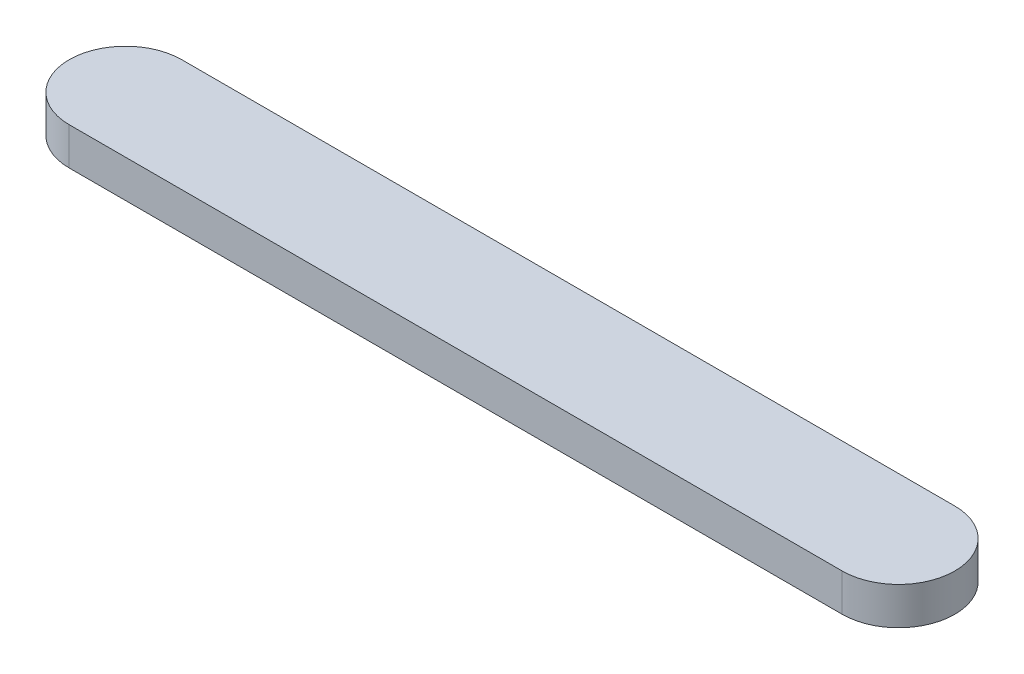
ISO-10303-21;
HEADER;
FILE_DESCRIPTION(('STEP AP214'),'2;1');
FILE_NAME('part.step','',(''),(''),'','','');
FILE_SCHEMA(('AUTOMOTIVE_DESIGN { 1 0 10303 214 1 1 1 1 }'));
ENDSEC;
DATA;
#1=APPLICATION_CONTEXT('core data for automotive mechanical design processes');
#2=APPLICATION_PROTOCOL_DEFINITION('international standard','automotive_design',2000,#1);
#3=PRODUCT_CONTEXT('',#1,'mechanical');
#4=PRODUCT('Part','Part','',(#3));
#5=PRODUCT_RELATED_PRODUCT_CATEGORY('part','',(#4));
#6=PRODUCT_DEFINITION_FORMATION('','',#4);
#7=PRODUCT_DEFINITION_CONTEXT('part definition',#1,'design');
#8=PRODUCT_DEFINITION('design','',#6,#7);
#9=PRODUCT_DEFINITION_SHAPE('','',#8);
#10=(LENGTH_UNIT() NAMED_UNIT(*) SI_UNIT(.MILLI.,.METRE.));
#11=(NAMED_UNIT(*) PLANE_ANGLE_UNIT() SI_UNIT($,.RADIAN.));
#12=(NAMED_UNIT(*) SI_UNIT($,.STERADIAN.) SOLID_ANGLE_UNIT());
#13=UNCERTAINTY_MEASURE_WITH_UNIT(LENGTH_MEASURE(1.E-05),#10,'distance_accuracy_value','');
#14=(GEOMETRIC_REPRESENTATION_CONTEXT(3) GLOBAL_UNCERTAINTY_ASSIGNED_CONTEXT((#13)) GLOBAL_UNIT_ASSIGNED_CONTEXT((#10,
#11,#12)) REPRESENTATION_CONTEXT('',''));
#15=CARTESIAN_POINT('',(0.,0.,0.));
#16=DIRECTION('',(0.,0.,1.));
#17=DIRECTION('',(1.,0.,0.));
#18=AXIS2_PLACEMENT_3D('',#15,#16,#17);
#19=CARTESIAN_POINT('',(-103.,10.,0.));
#20=DIRECTION('',(0.,-1.,0.));
#21=DIRECTION('',(0.,0.,-1.));
#22=AXIS2_PLACEMENT_3D('',#19,#20,#21);
#23=CYLINDRICAL_SURFACE('',#22,15.);
#24=CARTESIAN_POINT('',(-103.,0.,0.));
#25=DIRECTION('',(0.,1.,0.));
#26=DIRECTION('',(0.,0.,1.));
#27=AXIS2_PLACEMENT_3D('',#24,#25,#26);
#28=CIRCLE('',#27,15.);
#29=CARTESIAN_POINT('',(-103.,0.,-15.));
#30=VERTEX_POINT('',#29);
#31=CARTESIAN_POINT('',(-103.,0.,15.));
#32=VERTEX_POINT('',#31);
#33=EDGE_CURVE('E104',#30,#32,#28,.T.);
#34=ORIENTED_EDGE('',*,*,#33,.T.);
#35=DIRECTION('',(0.,-1.,0.));
#36=VECTOR('',#35,1.);
#37=CARTESIAN_POINT('',(-103.,10.,15.));
#38=LINE('',#37,#36);
#39=CARTESIAN_POINT('',(-103.,10.,15.));
#40=VERTEX_POINT('',#39);
#41=EDGE_CURVE('E11',#40,#32,#38,.T.);
#42=ORIENTED_EDGE('',*,*,#41,.F.);
#43=CARTESIAN_POINT('',(-103.,10.,0.));
#44=DIRECTION('',(0.,1.,0.));
#45=DIRECTION('',(0.,0.,1.));
#46=AXIS2_PLACEMENT_3D('',#43,#44,#45);
#47=CIRCLE('',#46,15.);
#48=CARTESIAN_POINT('',(-103.,10.,-15.));
#49=VERTEX_POINT('',#48);
#50=EDGE_CURVE('E92',#49,#40,#47,.T.);
#51=ORIENTED_EDGE('',*,*,#50,.F.);
#52=DIRECTION('',(0.,-1.,0.));
#53=VECTOR('',#52,1.);
#54=CARTESIAN_POINT('',(-103.,10.,-15.));
#55=LINE('',#54,#53);
#56=EDGE_CURVE('E100',#49,#30,#55,.T.);
#57=ORIENTED_EDGE('',*,*,#56,.T.);
#58=EDGE_LOOP('',(#34,#42,#51,#57));
#59=FACE_BOUND('',#58,.T.);
#60=ADVANCED_FACE('F41',(#59),#23,.T.);
#61=CARTESIAN_POINT('',(-103.,10.,15.));
#62=DIRECTION('',(0.,0.,-1.));
#63=DIRECTION('',(-1.,0.,0.));
#64=AXIS2_PLACEMENT_3D('',#61,#62,#63);
#65=PLANE('',#64);
#66=DIRECTION('',(1.,0.,0.));
#67=VECTOR('',#66,1.);
#68=CARTESIAN_POINT('',(-103.,0.,15.));
#69=LINE('',#68,#67);
#70=CARTESIAN_POINT('',(103.,0.,15.));
#71=VERTEX_POINT('',#70);
#72=EDGE_CURVE('E96',#32,#71,#69,.T.);
#73=ORIENTED_EDGE('',*,*,#72,.T.);
#74=DIRECTION('',(0.,-1.,0.));
#75=VECTOR('',#74,1.);
#76=CARTESIAN_POINT('',(103.,10.,15.));
#77=LINE('',#76,#75);
#78=CARTESIAN_POINT('',(103.,10.,15.));
#79=VERTEX_POINT('',#78);
#80=EDGE_CURVE('E49',#79,#71,#77,.T.);
#81=ORIENTED_EDGE('',*,*,#80,.F.);
#82=DIRECTION('',(1.,0.,0.));
#83=VECTOR('',#82,1.);
#84=CARTESIAN_POINT('',(-103.,10.,15.));
#85=LINE('',#84,#83);
#86=EDGE_CURVE('E87',#40,#79,#85,.T.);
#87=ORIENTED_EDGE('',*,*,#86,.F.);
#88=ORIENTED_EDGE('',*,*,#41,.T.);
#89=EDGE_LOOP('',(#73,#81,#87,#88));
#90=FACE_BOUND('',#89,.T.);
#91=ADVANCED_FACE('F95',(#90),#65,.F.);
#92=CARTESIAN_POINT('',(103.,10.,0.));
#93=DIRECTION('',(0.,-1.,0.));
#94=DIRECTION('',(0.,0.,-1.));
#95=AXIS2_PLACEMENT_3D('',#92,#93,#94);
#96=CYLINDRICAL_SURFACE('',#95,15.);
#97=CARTESIAN_POINT('',(103.,0.,0.));
#98=DIRECTION('',(0.,1.,0.));
#99=DIRECTION('',(0.,0.,-1.));
#100=AXIS2_PLACEMENT_3D('',#97,#98,#99);
#101=CIRCLE('',#100,15.);
#102=CARTESIAN_POINT('',(103.,0.,-15.));
#103=VERTEX_POINT('',#102);
#104=EDGE_CURVE('E74',#71,#103,#101,.T.);
#105=ORIENTED_EDGE('',*,*,#104,.T.);
#106=DIRECTION('',(0.,-1.,0.));
#107=VECTOR('',#106,1.);
#108=CARTESIAN_POINT('',(103.,10.,-15.));
#109=LINE('',#108,#107);
#110=CARTESIAN_POINT('',(103.,10.,-15.));
#111=VERTEX_POINT('',#110);
#112=EDGE_CURVE('E97',#111,#103,#109,.T.);
#113=ORIENTED_EDGE('',*,*,#112,.F.);
#114=CARTESIAN_POINT('',(103.,10.,0.));
#115=DIRECTION('',(0.,1.,0.));
#116=DIRECTION('',(0.,0.,-1.));
#117=AXIS2_PLACEMENT_3D('',#114,#115,#116);
#118=CIRCLE('',#117,15.);
#119=EDGE_CURVE('E90',#79,#111,#118,.T.);
#120=ORIENTED_EDGE('',*,*,#119,.F.);
#121=ORIENTED_EDGE('',*,*,#80,.T.);
#122=EDGE_LOOP('',(#105,#113,#120,#121));
#123=FACE_BOUND('',#122,.T.);
#124=ADVANCED_FACE('F98',(#123),#96,.T.);
#125=CARTESIAN_POINT('',(-103.,10.,-15.));
#126=DIRECTION('',(0.,0.,1.));
#127=DIRECTION('',(1.,0.,0.));
#128=AXIS2_PLACEMENT_3D('',#125,#126,#127);
#129=PLANE('',#128);
#130=DIRECTION('',(-1.,0.,0.));
#131=VECTOR('',#130,1.);
#132=CARTESIAN_POINT('',(-103.,0.,-15.));
#133=LINE('',#132,#131);
#134=EDGE_CURVE('E80',#103,#30,#133,.T.);
#135=ORIENTED_EDGE('',*,*,#134,.T.);
#136=ORIENTED_EDGE('',*,*,#56,.F.);
#137=DIRECTION('',(-1.,0.,0.));
#138=VECTOR('',#137,1.);
#139=CARTESIAN_POINT('',(-103.,10.,-15.));
#140=LINE('',#139,#138);
#141=EDGE_CURVE('E57',#111,#49,#140,.T.);
#142=ORIENTED_EDGE('',*,*,#141,.F.);
#143=ORIENTED_EDGE('',*,*,#112,.T.);
#144=EDGE_LOOP('',(#135,#136,#142,#143));
#145=FACE_BOUND('',#144,.T.);
#146=ADVANCED_FACE('F111',(#145),#129,.F.);
#147=CARTESIAN_POINT('',(-103.,10.,0.));
#148=DIRECTION('',(0.,1.,0.));
#149=DIRECTION('',(0.,0.,1.));
#150=AXIS2_PLACEMENT_3D('',#147,#148,#149);
#151=PLANE('',#150);
#152=ORIENTED_EDGE('',*,*,#50,.T.);
#153=ORIENTED_EDGE('',*,*,#86,.T.);
#154=ORIENTED_EDGE('',*,*,#119,.T.);
#155=ORIENTED_EDGE('',*,*,#141,.T.);
#156=EDGE_LOOP('',(#152,#153,#154,#155));
#157=FACE_BOUND('',#156,.T.);
#158=ADVANCED_FACE('F88',(#157),#151,.T.);
#159=CARTESIAN_POINT('',(-103.,0.,0.));
#160=DIRECTION('',(0.,1.,0.));
#161=DIRECTION('',(0.,0.,1.));
#162=AXIS2_PLACEMENT_3D('',#159,#160,#161);
#163=PLANE('',#162);
#164=ORIENTED_EDGE('',*,*,#33,.F.);
#165=ORIENTED_EDGE('',*,*,#134,.F.);
#166=ORIENTED_EDGE('',*,*,#104,.F.);
#167=ORIENTED_EDGE('',*,*,#72,.F.);
#168=EDGE_LOOP('',(#164,#165,#166,#167));
#169=FACE_BOUND('',#168,.T.);
#170=ADVANCED_FACE('F114',(#169),#163,.F.);
#171=CLOSED_SHELL('',(#60,#91,#124,#146,#158,#170));
#172=MANIFOLD_SOLID_BREP('B2',#171);
#173=ADVANCED_BREP_SHAPE_REPRESENTATION('',(#18,#172),#14);
#174=SHAPE_DEFINITION_REPRESENTATION(#9,#173);
ENDSEC;
END-ISO-10303-21;
